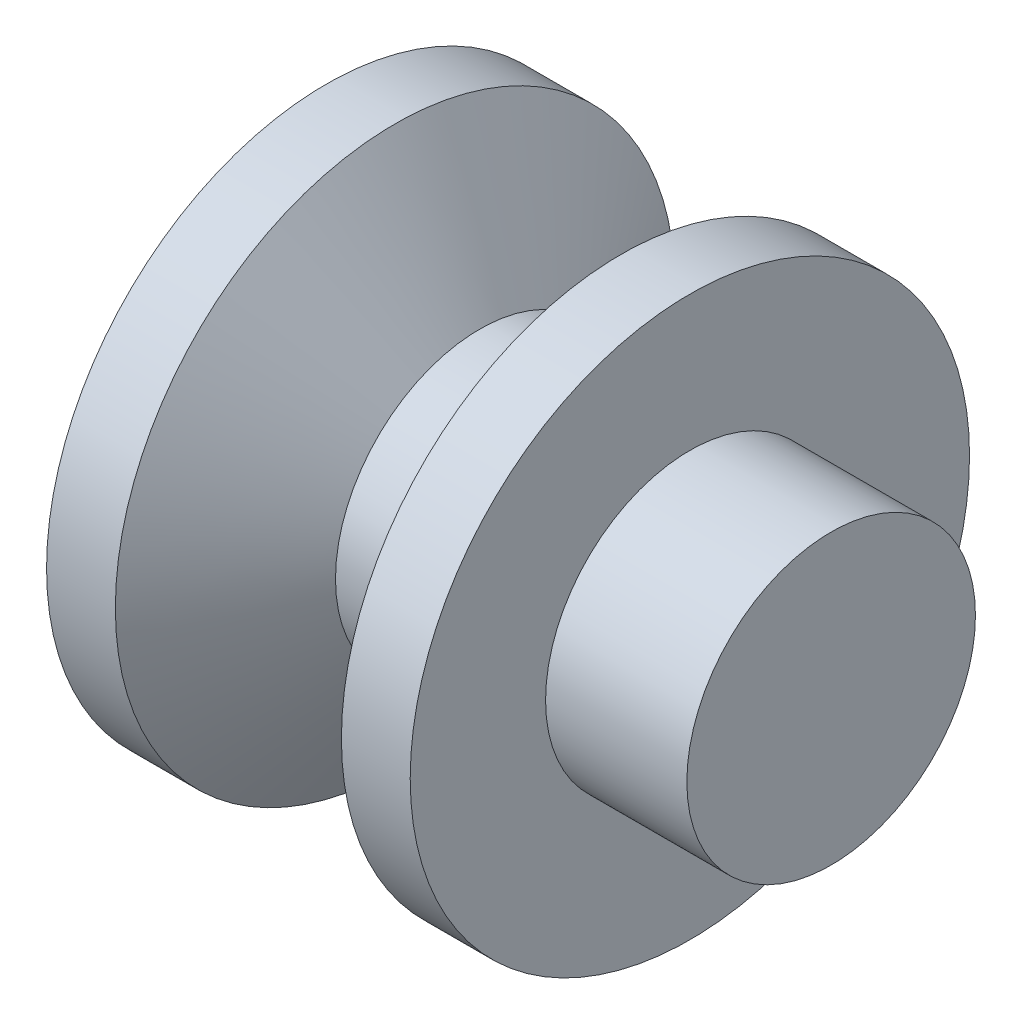
ISO-10303-21;
HEADER;
FILE_DESCRIPTION(('STEP AP214'),'2;1');
FILE_NAME('part.step','',(''),(''),'','','');
FILE_SCHEMA(('AUTOMOTIVE_DESIGN { 1 0 10303 214 1 1 1 1 }'));
ENDSEC;
DATA;
#1=APPLICATION_CONTEXT('core data for automotive mechanical design processes');
#2=APPLICATION_PROTOCOL_DEFINITION('international standard','automotive_design',2000,#1);
#3=PRODUCT_CONTEXT('',#1,'mechanical');
#4=PRODUCT('Part','Part','',(#3));
#5=PRODUCT_RELATED_PRODUCT_CATEGORY('part','',(#4));
#6=PRODUCT_DEFINITION_FORMATION('','',#4);
#7=PRODUCT_DEFINITION_CONTEXT('part definition',#1,'design');
#8=PRODUCT_DEFINITION('design','',#6,#7);
#9=PRODUCT_DEFINITION_SHAPE('','',#8);
#10=(LENGTH_UNIT() NAMED_UNIT(*) SI_UNIT(.MILLI.,.METRE.));
#11=(NAMED_UNIT(*) PLANE_ANGLE_UNIT() SI_UNIT($,.RADIAN.));
#12=(NAMED_UNIT(*) SI_UNIT($,.STERADIAN.) SOLID_ANGLE_UNIT());
#13=UNCERTAINTY_MEASURE_WITH_UNIT(LENGTH_MEASURE(1.E-05),#10,'distance_accuracy_value','');
#14=(GEOMETRIC_REPRESENTATION_CONTEXT(3) GLOBAL_UNCERTAINTY_ASSIGNED_CONTEXT((#13)) GLOBAL_UNIT_ASSIGNED_CONTEXT((#10,
#11,#12)) REPRESENTATION_CONTEXT('',''));
#15=CARTESIAN_POINT('',(0.,0.,0.));
#16=DIRECTION('',(0.,0.,1.));
#17=DIRECTION('',(1.,0.,0.));
#18=AXIS2_PLACEMENT_3D('',#15,#16,#17);
#19=CARTESIAN_POINT('',(0.,0.,0.));
#20=DIRECTION('',(1.,0.,0.));
#21=DIRECTION('',(0.,0.,-1.));
#22=AXIS2_PLACEMENT_3D('',#19,#20,#21);
#23=PLANE('',#22);
#24=CARTESIAN_POINT('',(0.,0.,0.));
#25=DIRECTION('',(-1.,0.,0.));
#26=DIRECTION('',(0.,0.,1.));
#27=AXIS2_PLACEMENT_3D('',#24,#25,#26);
#28=CIRCLE('',#27,19.795);
#29=CARTESIAN_POINT('',(0.,0.,19.795));
#30=VERTEX_POINT('',#29);
#31=EDGE_CURVE('E10',#30,#30,#28,.T.);
#32=ORIENTED_EDGE('',*,*,#31,.T.);
#33=EDGE_LOOP('',(#32));
#34=FACE_BOUND('',#33,.T.);
#35=ADVANCED_FACE('F31',(#34),#23,.F.);
#36=CARTESIAN_POINT('',(-743.156397809563,0.,0.));
#37=DIRECTION('',(-1.,0.,0.));
#38=DIRECTION('',(0.,0.,1.));
#39=AXIS2_PLACEMENT_3D('',#36,#37,#38);
#40=CYLINDRICAL_SURFACE('',#39,19.795);
#41=ORIENTED_EDGE('',*,*,#31,.F.);
#42=EDGE_LOOP('',(#41));
#43=FACE_BOUND('',#42,.T.);
#44=CARTESIAN_POINT('',(4.87000000000004,0.,0.));
#45=DIRECTION('',(-1.,0.,0.));
#46=DIRECTION('',(0.,0.,1.));
#47=AXIS2_PLACEMENT_3D('',#44,#45,#46);
#48=CIRCLE('',#47,19.795);
#49=CARTESIAN_POINT('',(4.87000000000004,0.,19.795));
#50=VERTEX_POINT('',#49);
#51=EDGE_CURVE('E37',#50,#50,#48,.T.);
#52=ORIENTED_EDGE('',*,*,#51,.T.);
#53=EDGE_LOOP('',(#52));
#54=FACE_BOUND('',#53,.T.);
#55=ADVANCED_FACE('F75',(#43,#54),#40,.T.);
#56=CARTESIAN_POINT('',(10.87,0.,0.));
#57=DIRECTION('',(-1.,0.,0.));
#58=DIRECTION('',(0.,0.,1.));
#59=AXIS2_PLACEMENT_3D('',#56,#57,#58);
#60=CONICAL_SURFACE('',#59,10.2138584474886,1.01131287661841);
#61=ORIENTED_EDGE('',*,*,#51,.F.);
#62=EDGE_LOOP('',(#61));
#63=FACE_BOUND('',#62,.T.);
#64=CARTESIAN_POINT('',(10.87,0.,0.));
#65=DIRECTION('',(-1.,0.,0.));
#66=DIRECTION('',(0.,0.,1.));
#67=AXIS2_PLACEMENT_3D('',#64,#65,#66);
#68=CIRCLE('',#67,10.2138584474886);
#69=CARTESIAN_POINT('',(10.87,0.,10.2138584474886));
#70=VERTEX_POINT('',#69);
#71=EDGE_CURVE('E41',#70,#70,#68,.T.);
#72=ORIENTED_EDGE('',*,*,#71,.T.);
#73=EDGE_LOOP('',(#72));
#74=FACE_BOUND('',#73,.T.);
#75=ADVANCED_FACE('F79',(#63,#74),#60,.T.);
#76=CARTESIAN_POINT('',(-743.156397809563,0.,0.));
#77=DIRECTION('',(-1.,0.,0.));
#78=DIRECTION('',(0.,0.,1.));
#79=AXIS2_PLACEMENT_3D('',#76,#77,#78);
#80=CYLINDRICAL_SURFACE('',#79,10.2138584474886);
#81=ORIENTED_EDGE('',*,*,#71,.F.);
#82=EDGE_LOOP('',(#81));
#83=FACE_BOUND('',#82,.T.);
#84=CARTESIAN_POINT('',(14.8700000000001,0.,0.));
#85=DIRECTION('',(-1.,0.,0.));
#86=DIRECTION('',(0.,0.,1.));
#87=AXIS2_PLACEMENT_3D('',#84,#85,#86);
#88=CIRCLE('',#87,10.2138584474886);
#89=CARTESIAN_POINT('',(14.8700000000001,0.,10.2138584474886));
#90=VERTEX_POINT('',#89);
#91=EDGE_CURVE('E45',#90,#90,#88,.T.);
#92=ORIENTED_EDGE('',*,*,#91,.T.);
#93=EDGE_LOOP('',(#92));
#94=FACE_BOUND('',#93,.T.);
#95=ADVANCED_FACE('F84',(#83,#94),#80,.T.);
#96=CARTESIAN_POINT('',(20.8700000000001,0.,0.));
#97=DIRECTION('',(1.,0.,0.));
#98=DIRECTION('',(0.,0.,-1.));
#99=AXIS2_PLACEMENT_3D('',#96,#97,#98);
#100=CONICAL_SURFACE('',#99,19.795,1.01131287661841);
#101=ORIENTED_EDGE('',*,*,#91,.F.);
#102=EDGE_LOOP('',(#101));
#103=FACE_BOUND('',#102,.T.);
#104=CARTESIAN_POINT('',(20.8700000000001,0.,0.));
#105=DIRECTION('',(-1.,0.,0.));
#106=DIRECTION('',(0.,0.,1.));
#107=AXIS2_PLACEMENT_3D('',#104,#105,#106);
#108=CIRCLE('',#107,19.795);
#109=CARTESIAN_POINT('',(20.8700000000001,0.,19.795));
#110=VERTEX_POINT('',#109);
#111=EDGE_CURVE('E50',#110,#110,#108,.T.);
#112=ORIENTED_EDGE('',*,*,#111,.T.);
#113=EDGE_LOOP('',(#112));
#114=FACE_BOUND('',#113,.T.);
#115=ADVANCED_FACE('F90',(#103,#114),#100,.T.);
#116=CARTESIAN_POINT('',(-743.156397809563,0.,0.));
#117=DIRECTION('',(-1.,0.,0.));
#118=DIRECTION('',(0.,0.,1.));
#119=AXIS2_PLACEMENT_3D('',#116,#117,#118);
#120=CYLINDRICAL_SURFACE('',#119,19.795);
#121=ORIENTED_EDGE('',*,*,#111,.F.);
#122=EDGE_LOOP('',(#121));
#123=FACE_BOUND('',#122,.T.);
#124=CARTESIAN_POINT('',(25.74,0.,0.));
#125=DIRECTION('',(-1.,0.,0.));
#126=DIRECTION('',(0.,0.,1.));
#127=AXIS2_PLACEMENT_3D('',#124,#125,#126);
#128=CIRCLE('',#127,19.795);
#129=CARTESIAN_POINT('',(25.74,0.,19.795));
#130=VERTEX_POINT('',#129);
#131=EDGE_CURVE('E53',#130,#130,#128,.T.);
#132=ORIENTED_EDGE('',*,*,#131,.T.);
#133=EDGE_LOOP('',(#132));
#134=FACE_BOUND('',#133,.T.);
#135=ADVANCED_FACE('F94',(#123,#134),#120,.T.);
#136=CARTESIAN_POINT('',(25.74,19.795,0.));
#137=DIRECTION('',(-1.,0.,0.));
#138=DIRECTION('',(0.,0.,1.));
#139=AXIS2_PLACEMENT_3D('',#136,#137,#138);
#140=PLANE('',#139);
#141=ORIENTED_EDGE('',*,*,#131,.F.);
#142=EDGE_LOOP('',(#141));
#143=FACE_BOUND('',#142,.T.);
#144=CARTESIAN_POINT('',(25.74,0.,0.));
#145=DIRECTION('',(-1.,0.,0.));
#146=DIRECTION('',(0.,0.,1.));
#147=AXIS2_PLACEMENT_3D('',#144,#145,#146);
#148=CIRCLE('',#147,10.2138584474886);
#149=CARTESIAN_POINT('',(25.74,0.,10.2138584474886));
#150=VERTEX_POINT('',#149);
#151=EDGE_CURVE('E56',#150,#150,#148,.T.);
#152=ORIENTED_EDGE('',*,*,#151,.T.);
#153=EDGE_LOOP('',(#152));
#154=FACE_BOUND('',#153,.T.);
#155=ADVANCED_FACE('F71',(#143,#154),#140,.F.);
#156=CARTESIAN_POINT('',(-743.156397809563,0.,0.));
#157=DIRECTION('',(-1.,0.,0.));
#158=DIRECTION('',(0.,0.,1.));
#159=AXIS2_PLACEMENT_3D('',#156,#157,#158);
#160=CYLINDRICAL_SURFACE('',#159,10.2138584474886);
#161=ORIENTED_EDGE('',*,*,#151,.F.);
#162=EDGE_LOOP('',(#161));
#163=FACE_BOUND('',#162,.T.);
#164=CARTESIAN_POINT('',(35.74,0.,0.));
#165=DIRECTION('',(-1.,0.,0.));
#166=DIRECTION('',(0.,0.,1.));
#167=AXIS2_PLACEMENT_3D('',#164,#165,#166);
#168=CIRCLE('',#167,10.2138584474886);
#169=CARTESIAN_POINT('',(35.74,0.,10.2138584474886));
#170=VERTEX_POINT('',#169);
#171=EDGE_CURVE('E59',#170,#170,#168,.T.);
#172=ORIENTED_EDGE('',*,*,#171,.T.);
#173=EDGE_LOOP('',(#172));
#174=FACE_BOUND('',#173,.T.);
#175=ADVANCED_FACE('F63',(#163,#174),#160,.T.);
#176=CARTESIAN_POINT('',(35.74,10.2138584474886,0.));
#177=DIRECTION('',(-1.,0.,0.));
#178=DIRECTION('',(0.,0.,1.));
#179=AXIS2_PLACEMENT_3D('',#176,#177,#178);
#180=PLANE('',#179);
#181=ORIENTED_EDGE('',*,*,#171,.F.);
#182=EDGE_LOOP('',(#181));
#183=FACE_BOUND('',#182,.T.);
#184=ADVANCED_FACE('F65',(#183),#180,.F.);
#185=CLOSED_SHELL('',(#35,#55,#75,#95,#115,#135,#155,#175,#184));
#186=MANIFOLD_SOLID_BREP('B2',#185);
#187=ADVANCED_BREP_SHAPE_REPRESENTATION('',(#18,#186),#14);
#188=SHAPE_DEFINITION_REPRESENTATION(#9,#187);
ENDSEC;
END-ISO-10303-21;
